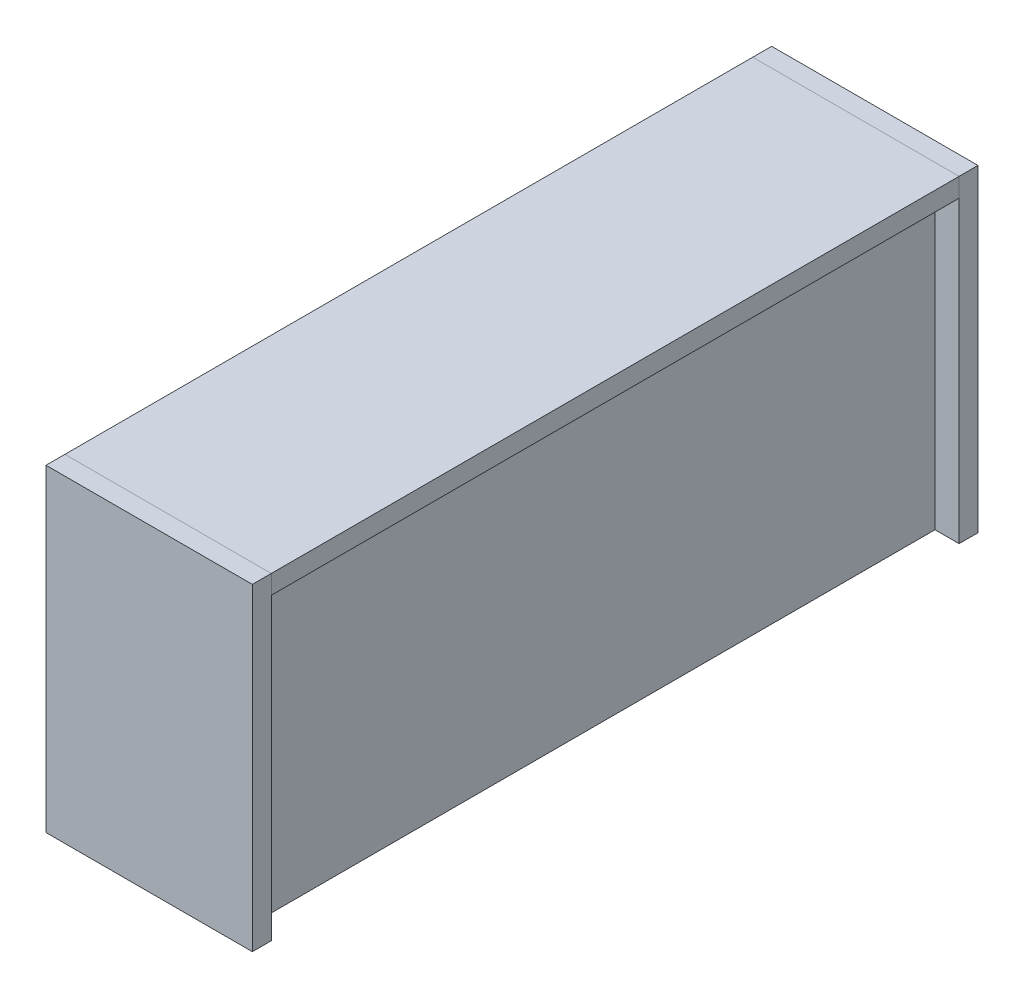
ISO-10303-21;
HEADER;
FILE_DESCRIPTION(('STEP AP214'),'2;1');
FILE_NAME('part.step','',(''),(''),'','','');
FILE_SCHEMA(('AUTOMOTIVE_DESIGN { 1 0 10303 214 1 1 1 1 }'));
ENDSEC;
DATA;
#1=APPLICATION_CONTEXT('core data for automotive mechanical design processes');
#2=APPLICATION_PROTOCOL_DEFINITION('international standard','automotive_design',2000,#1);
#3=PRODUCT_CONTEXT('',#1,'mechanical');
#4=PRODUCT('Part','Part','',(#3));
#5=PRODUCT_RELATED_PRODUCT_CATEGORY('part','',(#4));
#6=PRODUCT_DEFINITION_FORMATION('','',#4);
#7=PRODUCT_DEFINITION_CONTEXT('part definition',#1,'design');
#8=PRODUCT_DEFINITION('design','',#6,#7);
#9=PRODUCT_DEFINITION_SHAPE('','',#8);
#10=(LENGTH_UNIT() NAMED_UNIT(*) SI_UNIT(.MILLI.,.METRE.));
#11=(NAMED_UNIT(*) PLANE_ANGLE_UNIT() SI_UNIT($,.RADIAN.));
#12=(NAMED_UNIT(*) SI_UNIT($,.STERADIAN.) SOLID_ANGLE_UNIT());
#13=UNCERTAINTY_MEASURE_WITH_UNIT(LENGTH_MEASURE(1.E-05),#10,'distance_accuracy_value','');
#14=(GEOMETRIC_REPRESENTATION_CONTEXT(3) GLOBAL_UNCERTAINTY_ASSIGNED_CONTEXT((#13)) GLOBAL_UNIT_ASSIGNED_CONTEXT((#10,
#11,#12)) REPRESENTATION_CONTEXT('',''));
#15=CARTESIAN_POINT('',(0.,0.,0.));
#16=DIRECTION('',(0.,0.,1.));
#17=DIRECTION('',(1.,0.,0.));
#18=AXIS2_PLACEMENT_3D('',#15,#16,#17);
#19=CARTESIAN_POINT('',(-120.,0.,844.));
#20=DIRECTION('',(1.,0.,0.));
#21=DIRECTION('',(0.,1.,0.));
#22=AXIS2_PLACEMENT_3D('',#19,#20,#21);
#23=PLANE('',#22);
#24=DIRECTION('',(0.,-1.,0.));
#25=VECTOR('',#24,1.);
#26=CARTESIAN_POINT('',(-120.,0.,822.));
#27=LINE('',#26,#25);
#28=CARTESIAN_POINT('',(-120.,0.,822.));
#29=VERTEX_POINT('',#28);
#30=CARTESIAN_POINT('',(-120.,-370.,822.));
#31=VERTEX_POINT('',#30);
#32=EDGE_CURVE('E107',#29,#31,#27,.T.);
#33=ORIENTED_EDGE('',*,*,#32,.T.);
#34=DIRECTION('',(0.,0.,-1.));
#35=VECTOR('',#34,1.);
#36=CARTESIAN_POINT('',(-120.,-370.,844.));
#37=LINE('',#36,#35);
#38=CARTESIAN_POINT('',(-120.,-370.,844.));
#39=VERTEX_POINT('',#38);
#40=EDGE_CURVE('E12',#39,#31,#37,.T.);
#41=ORIENTED_EDGE('',*,*,#40,.F.);
#42=DIRECTION('',(0.,-1.,0.));
#43=VECTOR('',#42,1.);
#44=CARTESIAN_POINT('',(-120.,0.,844.));
#45=LINE('',#44,#43);
#46=CARTESIAN_POINT('',(-120.,0.,844.));
#47=VERTEX_POINT('',#46);
#48=EDGE_CURVE('E95',#47,#39,#45,.T.);
#49=ORIENTED_EDGE('',*,*,#48,.F.);
#50=DIRECTION('',(0.,0.,-1.));
#51=VECTOR('',#50,1.);
#52=CARTESIAN_POINT('',(-120.,0.,844.));
#53=LINE('',#52,#51);
#54=EDGE_CURVE('E103',#47,#29,#53,.T.);
#55=ORIENTED_EDGE('',*,*,#54,.T.);
#56=EDGE_LOOP('',(#33,#41,#49,#55));
#57=FACE_BOUND('',#56,.T.);
#58=ADVANCED_FACE('F44',(#57),#23,.F.);
#59=CARTESIAN_POINT('',(-120.,-370.,844.));
#60=DIRECTION('',(0.,1.,0.));
#61=DIRECTION('',(0.,0.,1.));
#62=AXIS2_PLACEMENT_3D('',#59,#60,#61);
#63=PLANE('',#62);
#64=DIRECTION('',(1.,0.,0.));
#65=VECTOR('',#64,1.);
#66=CARTESIAN_POINT('',(-120.,-370.,822.));
#67=LINE('',#66,#65);
#68=CARTESIAN_POINT('',(120.,-370.,822.));
#69=VERTEX_POINT('',#68);
#70=EDGE_CURVE('E99',#31,#69,#67,.T.);
#71=ORIENTED_EDGE('',*,*,#70,.T.);
#72=DIRECTION('',(0.,0.,-1.));
#73=VECTOR('',#72,1.);
#74=CARTESIAN_POINT('',(120.,-370.,844.));
#75=LINE('',#74,#73);
#76=CARTESIAN_POINT('',(120.,-370.,844.));
#77=VERTEX_POINT('',#76);
#78=EDGE_CURVE('E52',#77,#69,#75,.T.);
#79=ORIENTED_EDGE('',*,*,#78,.F.);
#80=DIRECTION('',(1.,0.,0.));
#81=VECTOR('',#80,1.);
#82=CARTESIAN_POINT('',(-120.,-370.,844.));
#83=LINE('',#82,#81);
#84=EDGE_CURVE('E90',#39,#77,#83,.T.);
#85=ORIENTED_EDGE('',*,*,#84,.F.);
#86=ORIENTED_EDGE('',*,*,#40,.T.);
#87=EDGE_LOOP('',(#71,#79,#85,#86));
#88=FACE_BOUND('',#87,.T.);
#89=ADVANCED_FACE('F98',(#88),#63,.F.);
#90=CARTESIAN_POINT('',(120.,0.,844.));
#91=DIRECTION('',(-1.,0.,0.));
#92=DIRECTION('',(0.,-1.,0.));
#93=AXIS2_PLACEMENT_3D('',#90,#91,#92);
#94=PLANE('',#93);
#95=DIRECTION('',(0.,1.,0.));
#96=VECTOR('',#95,1.);
#97=CARTESIAN_POINT('',(120.,0.,822.));
#98=LINE('',#97,#96);
#99=CARTESIAN_POINT('',(120.,0.,822.));
#100=VERTEX_POINT('',#99);
#101=EDGE_CURVE('E77',#69,#100,#98,.T.);
#102=ORIENTED_EDGE('',*,*,#101,.T.);
#103=DIRECTION('',(0.,0.,-1.));
#104=VECTOR('',#103,1.);
#105=CARTESIAN_POINT('',(120.,0.,844.));
#106=LINE('',#105,#104);
#107=CARTESIAN_POINT('',(120.,0.,844.));
#108=VERTEX_POINT('',#107);
#109=EDGE_CURVE('E100',#108,#100,#106,.T.);
#110=ORIENTED_EDGE('',*,*,#109,.F.);
#111=DIRECTION('',(0.,1.,0.));
#112=VECTOR('',#111,1.);
#113=CARTESIAN_POINT('',(120.,0.,844.));
#114=LINE('',#113,#112);
#115=EDGE_CURVE('E93',#77,#108,#114,.T.);
#116=ORIENTED_EDGE('',*,*,#115,.F.);
#117=ORIENTED_EDGE('',*,*,#78,.T.);
#118=EDGE_LOOP('',(#102,#110,#116,#117));
#119=FACE_BOUND('',#118,.T.);
#120=ADVANCED_FACE('F101',(#119),#94,.F.);
#121=CARTESIAN_POINT('',(-120.,0.,844.));
#122=DIRECTION('',(0.,-1.,0.));
#123=DIRECTION('',(1.,0.,0.));
#124=AXIS2_PLACEMENT_3D('',#121,#122,#123);
#125=PLANE('',#124);
#126=DIRECTION('',(-1.,0.,0.));
#127=VECTOR('',#126,1.);
#128=CARTESIAN_POINT('',(-120.,0.,822.));
#129=LINE('',#128,#127);
#130=EDGE_CURVE('E83',#100,#29,#129,.T.);
#131=ORIENTED_EDGE('',*,*,#130,.T.);
#132=ORIENTED_EDGE('',*,*,#54,.F.);
#133=DIRECTION('',(-1.,0.,0.));
#134=VECTOR('',#133,1.);
#135=CARTESIAN_POINT('',(-120.,0.,844.));
#136=LINE('',#135,#134);
#137=EDGE_CURVE('E60',#108,#47,#136,.T.);
#138=ORIENTED_EDGE('',*,*,#137,.F.);
#139=ORIENTED_EDGE('',*,*,#109,.T.);
#140=EDGE_LOOP('',(#131,#132,#138,#139));
#141=FACE_BOUND('',#140,.T.);
#142=ADVANCED_FACE('F114',(#141),#125,.F.);
#143=CARTESIAN_POINT('',(0.,0.,844.));
#144=DIRECTION('',(0.,0.,1.));
#145=DIRECTION('',(1.,0.,0.));
#146=AXIS2_PLACEMENT_3D('',#143,#144,#145);
#147=PLANE('',#146);
#148=ORIENTED_EDGE('',*,*,#48,.T.);
#149=ORIENTED_EDGE('',*,*,#84,.T.);
#150=ORIENTED_EDGE('',*,*,#115,.T.);
#151=ORIENTED_EDGE('',*,*,#137,.T.);
#152=EDGE_LOOP('',(#148,#149,#150,#151));
#153=FACE_BOUND('',#152,.T.);
#154=ADVANCED_FACE('F91',(#153),#147,.T.);
#155=CARTESIAN_POINT('',(0.,0.,822.));
#156=DIRECTION('',(0.,0.,1.));
#157=DIRECTION('',(1.,0.,0.));
#158=AXIS2_PLACEMENT_3D('',#155,#156,#157);
#159=PLANE('',#158);
#160=ORIENTED_EDGE('',*,*,#32,.F.);
#161=ORIENTED_EDGE('',*,*,#130,.F.);
#162=ORIENTED_EDGE('',*,*,#101,.F.);
#163=ORIENTED_EDGE('',*,*,#70,.F.);
#164=EDGE_LOOP('',(#160,#161,#162,#163));
#165=FACE_BOUND('',#164,.T.);
#166=ADVANCED_FACE('F117',(#165),#159,.F.);
#167=CLOSED_SHELL('',(#58,#89,#120,#142,#154,#166));
#168=MANIFOLD_SOLID_BREP('B2',#167);
#169=CARTESIAN_POINT('',(-120.,0.,1063.00622398602));
#170=DIRECTION('',(1.,0.,0.));
#171=DIRECTION('',(0.,0.,-1.));
#172=AXIS2_PLACEMENT_3D('',#169,#170,#171);
#173=PLANE('',#172);
#174=DIRECTION('',(0.,-1.,0.));
#175=VECTOR('',#174,1.);
#176=CARTESIAN_POINT('',(-120.,0.,822.));
#177=LINE('',#176,#175);
#178=CARTESIAN_POINT('',(-120.,0.,822.));
#179=VERTEX_POINT('',#178);
#180=CARTESIAN_POINT('',(-120.,-22.,822.));
#181=VERTEX_POINT('',#180);
#182=EDGE_CURVE('E228',#179,#181,#177,.T.);
#183=ORIENTED_EDGE('',*,*,#182,.F.);
#184=DIRECTION('',(0.,0.,-1.));
#185=VECTOR('',#184,1.);
#186=CARTESIAN_POINT('',(-120.,0.,1063.00622398602));
#187=LINE('',#186,#185);
#188=CARTESIAN_POINT('',(-120.,0.,22.));
#189=VERTEX_POINT('',#188);
#190=EDGE_CURVE('E182',#179,#189,#187,.T.);
#191=ORIENTED_EDGE('',*,*,#190,.T.);
#192=DIRECTION('',(0.,-1.,0.));
#193=VECTOR('',#192,1.);
#194=CARTESIAN_POINT('',(-120.,0.,22.));
#195=LINE('',#194,#193);
#196=CARTESIAN_POINT('',(-120.,-22.,22.));
#197=VERTEX_POINT('',#196);
#198=EDGE_CURVE('E226',#189,#197,#195,.T.);
#199=ORIENTED_EDGE('',*,*,#198,.T.);
#200=DIRECTION('',(0.,0.,-1.));
#201=VECTOR('',#200,1.);
#202=CARTESIAN_POINT('',(-120.,-22.,1063.00622398602));
#203=LINE('',#202,#201);
#204=EDGE_CURVE('E217',#181,#197,#203,.T.);
#205=ORIENTED_EDGE('',*,*,#204,.F.);
#206=EDGE_LOOP('',(#183,#191,#199,#205));
#207=FACE_BOUND('',#206,.T.);
#208=ADVANCED_FACE('F178',(#207),#173,.F.);
#209=CARTESIAN_POINT('',(-120.,-22.,1063.00622398602));
#210=DIRECTION('',(0.,1.,0.));
#211=DIRECTION('',(-1.,0.,0.));
#212=AXIS2_PLACEMENT_3D('',#209,#210,#211);
#213=PLANE('',#212);
#214=DIRECTION('',(1.,0.,0.));
#215=VECTOR('',#214,1.);
#216=CARTESIAN_POINT('',(-120.,-22.,822.));
#217=LINE('',#216,#215);
#218=CARTESIAN_POINT('',(120.,-22.,822.));
#219=VERTEX_POINT('',#218);
#220=EDGE_CURVE('E187',#181,#219,#217,.T.);
#221=ORIENTED_EDGE('',*,*,#220,.F.);
#222=ORIENTED_EDGE('',*,*,#204,.T.);
#223=DIRECTION('',(1.,0.,0.));
#224=VECTOR('',#223,1.);
#225=CARTESIAN_POINT('',(-120.,-22.,22.));
#226=LINE('',#225,#224);
#227=CARTESIAN_POINT('',(120.,-22.,22.));
#228=VERTEX_POINT('',#227);
#229=EDGE_CURVE('E238',#197,#228,#226,.T.);
#230=ORIENTED_EDGE('',*,*,#229,.T.);
#231=DIRECTION('',(0.,0.,-1.));
#232=VECTOR('',#231,1.);
#233=CARTESIAN_POINT('',(120.,-22.,1063.00622398602));
#234=LINE('',#233,#232);
#235=EDGE_CURVE('E247',#219,#228,#234,.T.);
#236=ORIENTED_EDGE('',*,*,#235,.F.);
#237=EDGE_LOOP('',(#221,#222,#230,#236));
#238=FACE_BOUND('',#237,.T.);
#239=ADVANCED_FACE('F251',(#238),#213,.F.);
#240=CARTESIAN_POINT('',(120.,0.,1063.00622398602));
#241=DIRECTION('',(-1.,0.,0.));
#242=DIRECTION('',(0.,0.,1.));
#243=AXIS2_PLACEMENT_3D('',#240,#241,#242);
#244=PLANE('',#243);
#245=DIRECTION('',(0.,1.,0.));
#246=VECTOR('',#245,1.);
#247=CARTESIAN_POINT('',(120.,0.,822.));
#248=LINE('',#247,#246);
#249=CARTESIAN_POINT('',(120.,0.,822.));
#250=VERTEX_POINT('',#249);
#251=EDGE_CURVE('E42',#219,#250,#248,.T.);
#252=ORIENTED_EDGE('',*,*,#251,.F.);
#253=ORIENTED_EDGE('',*,*,#235,.T.);
#254=DIRECTION('',(0.,1.,0.));
#255=VECTOR('',#254,1.);
#256=CARTESIAN_POINT('',(120.,0.,22.));
#257=LINE('',#256,#255);
#258=CARTESIAN_POINT('',(120.,0.,22.));
#259=VERTEX_POINT('',#258);
#260=EDGE_CURVE('E248',#228,#259,#257,.T.);
#261=ORIENTED_EDGE('',*,*,#260,.T.);
#262=DIRECTION('',(0.,0.,-1.));
#263=VECTOR('',#262,1.);
#264=CARTESIAN_POINT('',(120.,0.,1063.00622398602));
#265=LINE('',#264,#263);
#266=EDGE_CURVE('E200',#250,#259,#265,.T.);
#267=ORIENTED_EDGE('',*,*,#266,.F.);
#268=EDGE_LOOP('',(#252,#253,#261,#267));
#269=FACE_BOUND('',#268,.T.);
#270=ADVANCED_FACE('F250',(#269),#244,.F.);
#271=CARTESIAN_POINT('',(-120.,0.,1063.00622398602));
#272=DIRECTION('',(0.,-1.,0.));
#273=DIRECTION('',(1.,0.,0.));
#274=AXIS2_PLACEMENT_3D('',#271,#272,#273);
#275=PLANE('',#274);
#276=DIRECTION('',(-1.,0.,0.));
#277=VECTOR('',#276,1.);
#278=CARTESIAN_POINT('',(-120.,0.,822.));
#279=LINE('',#278,#277);
#280=EDGE_CURVE('E235',#250,#179,#279,.T.);
#281=ORIENTED_EDGE('',*,*,#280,.F.);
#282=ORIENTED_EDGE('',*,*,#266,.T.);
#283=DIRECTION('',(-1.,0.,0.));
#284=VECTOR('',#283,1.);
#285=CARTESIAN_POINT('',(-120.,0.,22.));
#286=LINE('',#285,#284);
#287=EDGE_CURVE('E231',#259,#189,#286,.T.);
#288=ORIENTED_EDGE('',*,*,#287,.T.);
#289=ORIENTED_EDGE('',*,*,#190,.F.);
#290=EDGE_LOOP('',(#281,#282,#288,#289));
#291=FACE_BOUND('',#290,.T.);
#292=ADVANCED_FACE('F232',(#291),#275,.F.);
#293=CARTESIAN_POINT('',(0.,0.,22.));
#294=DIRECTION('',(0.,0.,1.));
#295=DIRECTION('',(1.,0.,0.));
#296=AXIS2_PLACEMENT_3D('',#293,#294,#295);
#297=PLANE('',#296);
#298=ORIENTED_EDGE('',*,*,#198,.F.);
#299=ORIENTED_EDGE('',*,*,#287,.F.);
#300=ORIENTED_EDGE('',*,*,#260,.F.);
#301=ORIENTED_EDGE('',*,*,#229,.F.);
#302=EDGE_LOOP('',(#298,#299,#300,#301));
#303=FACE_BOUND('',#302,.T.);
#304=ADVANCED_FACE('F237',(#303),#297,.F.);
#305=CARTESIAN_POINT('',(0.,0.,822.));
#306=DIRECTION('',(0.,0.,1.));
#307=DIRECTION('',(1.,0.,0.));
#308=AXIS2_PLACEMENT_3D('',#305,#306,#307);
#309=PLANE('',#308);
#310=ORIENTED_EDGE('',*,*,#280,.T.);
#311=ORIENTED_EDGE('',*,*,#182,.T.);
#312=ORIENTED_EDGE('',*,*,#220,.T.);
#313=ORIENTED_EDGE('',*,*,#251,.T.);
#314=EDGE_LOOP('',(#310,#311,#312,#313));
#315=FACE_BOUND('',#314,.T.);
#316=ADVANCED_FACE('F180',(#315),#309,.T.);
#317=CLOSED_SHELL('',(#208,#239,#270,#292,#304,#316));
#318=MANIFOLD_SOLID_BREP('B6',#317);
#319=CARTESIAN_POINT('',(-70.,-22.,822.));
#320=DIRECTION('',(-1.,0.,0.));
#321=DIRECTION('',(0.,-1.,0.));
#322=AXIS2_PLACEMENT_3D('',#319,#320,#321);
#323=PLANE('',#322);
#324=DIRECTION('',(0.,1.,0.));
#325=VECTOR('',#324,1.);
#326=CARTESIAN_POINT('',(-70.,-22.,22.));
#327=LINE('',#326,#325);
#328=CARTESIAN_POINT('',(-70.,-370.,22.));
#329=VERTEX_POINT('',#328);
#330=CARTESIAN_POINT('',(-70.,-22.,22.));
#331=VERTEX_POINT('',#330);
#332=EDGE_CURVE('E375',#329,#331,#327,.T.);
#333=ORIENTED_EDGE('',*,*,#332,.T.);
#334=DIRECTION('',(0.,0.,-1.));
#335=VECTOR('',#334,1.);
#336=CARTESIAN_POINT('',(-70.,-22.,822.));
#337=LINE('',#336,#335);
#338=CARTESIAN_POINT('',(-70.,-22.,822.));
#339=VERTEX_POINT('',#338);
#340=EDGE_CURVE('E176',#339,#331,#337,.T.);
#341=ORIENTED_EDGE('',*,*,#340,.F.);
#342=DIRECTION('',(0.,1.,0.));
#343=VECTOR('',#342,1.);
#344=CARTESIAN_POINT('',(-70.,-22.,822.));
#345=LINE('',#344,#343);
#346=CARTESIAN_POINT('',(-70.,-370.,822.));
#347=VERTEX_POINT('',#346);
#348=EDGE_CURVE('E363',#347,#339,#345,.T.);
#349=ORIENTED_EDGE('',*,*,#348,.F.);
#350=DIRECTION('',(0.,0.,-1.));
#351=VECTOR('',#350,1.);
#352=CARTESIAN_POINT('',(-70.,-370.,822.));
#353=LINE('',#352,#351);
#354=EDGE_CURVE('E371',#347,#329,#353,.T.);
#355=ORIENTED_EDGE('',*,*,#354,.T.);
#356=EDGE_LOOP('',(#333,#341,#349,#355));
#357=FACE_BOUND('',#356,.T.);
#358=ADVANCED_FACE('F312',(#357),#323,.F.);
#359=CARTESIAN_POINT('',(-70.,-22.,822.));
#360=DIRECTION('',(0.,-1.,0.));
#361=DIRECTION('',(1.,0.,0.));
#362=AXIS2_PLACEMENT_3D('',#359,#360,#361);
#363=PLANE('',#362);
#364=DIRECTION('',(-1.,0.,0.));
#365=VECTOR('',#364,1.);
#366=CARTESIAN_POINT('',(-70.,-22.,22.));
#367=LINE('',#366,#365);
#368=CARTESIAN_POINT('',(-92.,-22.,22.));
#369=VERTEX_POINT('',#368);
#370=EDGE_CURVE('E367',#331,#369,#367,.T.);
#371=ORIENTED_EDGE('',*,*,#370,.T.);
#372=DIRECTION('',(0.,0.,-1.));
#373=VECTOR('',#372,1.);
#374=CARTESIAN_POINT('',(-92.,-22.,822.));
#375=LINE('',#374,#373);
#376=CARTESIAN_POINT('',(-92.,-22.,822.));
#377=VERTEX_POINT('',#376);
#378=EDGE_CURVE('E320',#377,#369,#375,.T.);
#379=ORIENTED_EDGE('',*,*,#378,.F.);
#380=DIRECTION('',(-1.,0.,0.));
#381=VECTOR('',#380,1.);
#382=CARTESIAN_POINT('',(-70.,-22.,822.));
#383=LINE('',#382,#381);
#384=EDGE_CURVE('E358',#339,#377,#383,.T.);
#385=ORIENTED_EDGE('',*,*,#384,.F.);
#386=ORIENTED_EDGE('',*,*,#340,.T.);
#387=EDGE_LOOP('',(#371,#379,#385,#386));
#388=FACE_BOUND('',#387,.T.);
#389=ADVANCED_FACE('F366',(#388),#363,.F.);
#390=CARTESIAN_POINT('',(-92.,-22.,822.));
#391=DIRECTION('',(1.,0.,0.));
#392=DIRECTION('',(0.,1.,0.));
#393=AXIS2_PLACEMENT_3D('',#390,#391,#392);
#394=PLANE('',#393);
#395=DIRECTION('',(0.,-1.,0.));
#396=VECTOR('',#395,1.);
#397=CARTESIAN_POINT('',(-92.,-22.,22.));
#398=LINE('',#397,#396);
#399=CARTESIAN_POINT('',(-92.,-370.,22.));
#400=VERTEX_POINT('',#399);
#401=EDGE_CURVE('E345',#369,#400,#398,.T.);
#402=ORIENTED_EDGE('',*,*,#401,.T.);
#403=DIRECTION('',(0.,0.,-1.));
#404=VECTOR('',#403,1.);
#405=CARTESIAN_POINT('',(-92.,-370.,822.));
#406=LINE('',#405,#404);
#407=CARTESIAN_POINT('',(-92.,-370.,822.));
#408=VERTEX_POINT('',#407);
#409=EDGE_CURVE('E368',#408,#400,#406,.T.);
#410=ORIENTED_EDGE('',*,*,#409,.F.);
#411=DIRECTION('',(0.,-1.,0.));
#412=VECTOR('',#411,1.);
#413=CARTESIAN_POINT('',(-92.,-22.,822.));
#414=LINE('',#413,#412);
#415=EDGE_CURVE('E361',#377,#408,#414,.T.);
#416=ORIENTED_EDGE('',*,*,#415,.F.);
#417=ORIENTED_EDGE('',*,*,#378,.T.);
#418=EDGE_LOOP('',(#402,#410,#416,#417));
#419=FACE_BOUND('',#418,.T.);
#420=ADVANCED_FACE('F369',(#419),#394,.F.);
#421=CARTESIAN_POINT('',(-70.,-370.,822.));
#422=DIRECTION('',(0.,1.,0.));
#423=DIRECTION('',(0.,0.,1.));
#424=AXIS2_PLACEMENT_3D('',#421,#422,#423);
#425=PLANE('',#424);
#426=DIRECTION('',(1.,0.,0.));
#427=VECTOR('',#426,1.);
#428=CARTESIAN_POINT('',(-70.,-370.,22.));
#429=LINE('',#428,#427);
#430=EDGE_CURVE('E351',#400,#329,#429,.T.);
#431=ORIENTED_EDGE('',*,*,#430,.T.);
#432=ORIENTED_EDGE('',*,*,#354,.F.);
#433=DIRECTION('',(1.,0.,0.));
#434=VECTOR('',#433,1.);
#435=CARTESIAN_POINT('',(-70.,-370.,822.));
#436=LINE('',#435,#434);
#437=EDGE_CURVE('E328',#408,#347,#436,.T.);
#438=ORIENTED_EDGE('',*,*,#437,.F.);
#439=ORIENTED_EDGE('',*,*,#409,.T.);
#440=EDGE_LOOP('',(#431,#432,#438,#439));
#441=FACE_BOUND('',#440,.T.);
#442=ADVANCED_FACE('F382',(#441),#425,.F.);
#443=CARTESIAN_POINT('',(0.,0.,822.));
#444=DIRECTION('',(0.,0.,-1.));
#445=DIRECTION('',(-1.,0.,0.));
#446=AXIS2_PLACEMENT_3D('',#443,#444,#445);
#447=PLANE('',#446);
#448=ORIENTED_EDGE('',*,*,#348,.T.);
#449=ORIENTED_EDGE('',*,*,#384,.T.);
#450=ORIENTED_EDGE('',*,*,#415,.T.);
#451=ORIENTED_EDGE('',*,*,#437,.T.);
#452=EDGE_LOOP('',(#448,#449,#450,#451));
#453=FACE_BOUND('',#452,.T.);
#454=ADVANCED_FACE('F359',(#453),#447,.F.);
#455=CARTESIAN_POINT('',(0.,0.,22.));
#456=DIRECTION('',(0.,0.,-1.));
#457=DIRECTION('',(-1.,0.,0.));
#458=AXIS2_PLACEMENT_3D('',#455,#456,#457);
#459=PLANE('',#458);
#460=ORIENTED_EDGE('',*,*,#332,.F.);
#461=ORIENTED_EDGE('',*,*,#430,.F.);
#462=ORIENTED_EDGE('',*,*,#401,.F.);
#463=ORIENTED_EDGE('',*,*,#370,.F.);
#464=EDGE_LOOP('',(#460,#461,#462,#463));
#465=FACE_BOUND('',#464,.T.);
#466=ADVANCED_FACE('F385',(#465),#459,.T.);
#467=CLOSED_SHELL('',(#358,#389,#420,#442,#454,#466));
#468=MANIFOLD_SOLID_BREP('B36',#467);
#469=CARTESIAN_POINT('',(70.,-22.,822.));
#470=DIRECTION('',(1.,0.,0.));
#471=DIRECTION('',(0.,1.,0.));
#472=AXIS2_PLACEMENT_3D('',#469,#470,#471);
#473=PLANE('',#472);
#474=DIRECTION('',(0.,-1.,0.));
#475=VECTOR('',#474,1.);
#476=CARTESIAN_POINT('',(70.,-22.,22.));
#477=LINE('',#476,#475);
#478=CARTESIAN_POINT('',(70.,-22.,22.));
#479=VERTEX_POINT('',#478);
#480=CARTESIAN_POINT('',(70.,-370.,22.));
#481=VERTEX_POINT('',#480);
#482=EDGE_CURVE('E508',#479,#481,#477,.T.);
#483=ORIENTED_EDGE('',*,*,#482,.T.);
#484=DIRECTION('',(0.,0.,-1.));
#485=VECTOR('',#484,1.);
#486=CARTESIAN_POINT('',(70.,-370.,822.));
#487=LINE('',#486,#485);
#488=CARTESIAN_POINT('',(70.,-370.,822.));
#489=VERTEX_POINT('',#488);
#490=EDGE_CURVE('E310',#489,#481,#487,.T.);
#491=ORIENTED_EDGE('',*,*,#490,.F.);
#492=DIRECTION('',(0.,-1.,0.));
#493=VECTOR('',#492,1.);
#494=CARTESIAN_POINT('',(70.,-22.,822.));
#495=LINE('',#494,#493);
#496=CARTESIAN_POINT('',(70.,-22.,822.));
#497=VERTEX_POINT('',#496);
#498=EDGE_CURVE('E496',#497,#489,#495,.T.);
#499=ORIENTED_EDGE('',*,*,#498,.F.);
#500=DIRECTION('',(0.,0.,-1.));
#501=VECTOR('',#500,1.);
#502=CARTESIAN_POINT('',(70.,-22.,822.));
#503=LINE('',#502,#501);
#504=EDGE_CURVE('E504',#497,#479,#503,.T.);
#505=ORIENTED_EDGE('',*,*,#504,.T.);
#506=EDGE_LOOP('',(#483,#491,#499,#505));
#507=FACE_BOUND('',#506,.T.);
#508=ADVANCED_FACE('F445',(#507),#473,.F.);
#509=CARTESIAN_POINT('',(70.,-370.,822.));
#510=DIRECTION('',(0.,1.,0.));
#511=DIRECTION('',(0.,0.,1.));
#512=AXIS2_PLACEMENT_3D('',#509,#510,#511);
#513=PLANE('',#512);
#514=DIRECTION('',(1.,0.,0.));
#515=VECTOR('',#514,1.);
#516=CARTESIAN_POINT('',(70.,-370.,22.));
#517=LINE('',#516,#515);
#518=CARTESIAN_POINT('',(92.0000000000001,-370.,22.));
#519=VERTEX_POINT('',#518);
#520=EDGE_CURVE('E500',#481,#519,#517,.T.);
#521=ORIENTED_EDGE('',*,*,#520,.T.);
#522=DIRECTION('',(0.,0.,-1.));
#523=VECTOR('',#522,1.);
#524=CARTESIAN_POINT('',(92.0000000000001,-370.,822.));
#525=LINE('',#524,#523);
#526=CARTESIAN_POINT('',(92.0000000000001,-370.,822.));
#527=VERTEX_POINT('',#526);
#528=EDGE_CURVE('E453',#527,#519,#525,.T.);
#529=ORIENTED_EDGE('',*,*,#528,.F.);
#530=DIRECTION('',(1.,0.,0.));
#531=VECTOR('',#530,1.);
#532=CARTESIAN_POINT('',(70.,-370.,822.));
#533=LINE('',#532,#531);
#534=EDGE_CURVE('E491',#489,#527,#533,.T.);
#535=ORIENTED_EDGE('',*,*,#534,.F.);
#536=ORIENTED_EDGE('',*,*,#490,.T.);
#537=EDGE_LOOP('',(#521,#529,#535,#536));
#538=FACE_BOUND('',#537,.T.);
#539=ADVANCED_FACE('F499',(#538),#513,.F.);
#540=CARTESIAN_POINT('',(92.,-22.,822.));
#541=DIRECTION('',(-1.,0.,0.));
#542=DIRECTION('',(0.,-1.,0.));
#543=AXIS2_PLACEMENT_3D('',#540,#541,#542);
#544=PLANE('',#543);
#545=DIRECTION('',(0.,1.,0.));
#546=VECTOR('',#545,1.);
#547=CARTESIAN_POINT('',(92.,-22.,22.));
#548=LINE('',#547,#546);
#549=CARTESIAN_POINT('',(92.,-22.,22.));
#550=VERTEX_POINT('',#549);
#551=EDGE_CURVE('E478',#519,#550,#548,.T.);
#552=ORIENTED_EDGE('',*,*,#551,.T.);
#553=DIRECTION('',(0.,0.,-1.));
#554=VECTOR('',#553,1.);
#555=CARTESIAN_POINT('',(92.,-22.,822.));
#556=LINE('',#555,#554);
#557=CARTESIAN_POINT('',(92.,-22.,822.));
#558=VERTEX_POINT('',#557);
#559=EDGE_CURVE('E501',#558,#550,#556,.T.);
#560=ORIENTED_EDGE('',*,*,#559,.F.);
#561=DIRECTION('',(0.,1.,0.));
#562=VECTOR('',#561,1.);
#563=CARTESIAN_POINT('',(92.,-22.,822.));
#564=LINE('',#563,#562);
#565=EDGE_CURVE('E494',#527,#558,#564,.T.);
#566=ORIENTED_EDGE('',*,*,#565,.F.);
#567=ORIENTED_EDGE('',*,*,#528,.T.);
#568=EDGE_LOOP('',(#552,#560,#566,#567));
#569=FACE_BOUND('',#568,.T.);
#570=ADVANCED_FACE('F502',(#569),#544,.F.);
#571=CARTESIAN_POINT('',(70.,-22.,822.));
#572=DIRECTION('',(0.,-1.,0.));
#573=DIRECTION('',(0.,0.,-1.));
#574=AXIS2_PLACEMENT_3D('',#571,#572,#573);
#575=PLANE('',#574);
#576=DIRECTION('',(-1.,0.,0.));
#577=VECTOR('',#576,1.);
#578=CARTESIAN_POINT('',(70.,-22.,22.));
#579=LINE('',#578,#577);
#580=EDGE_CURVE('E484',#550,#479,#579,.T.);
#581=ORIENTED_EDGE('',*,*,#580,.T.);
#582=ORIENTED_EDGE('',*,*,#504,.F.);
#583=DIRECTION('',(-1.,0.,0.));
#584=VECTOR('',#583,1.);
#585=CARTESIAN_POINT('',(70.,-22.,822.));
#586=LINE('',#585,#584);
#587=EDGE_CURVE('E461',#558,#497,#586,.T.);
#588=ORIENTED_EDGE('',*,*,#587,.F.);
#589=ORIENTED_EDGE('',*,*,#559,.T.);
#590=EDGE_LOOP('',(#581,#582,#588,#589));
#591=FACE_BOUND('',#590,.T.);
#592=ADVANCED_FACE('F515',(#591),#575,.F.);
#593=CARTESIAN_POINT('',(0.,0.,822.));
#594=DIRECTION('',(0.,0.,1.));
#595=DIRECTION('',(1.,0.,0.));
#596=AXIS2_PLACEMENT_3D('',#593,#594,#595);
#597=PLANE('',#596);
#598=ORIENTED_EDGE('',*,*,#498,.T.);
#599=ORIENTED_EDGE('',*,*,#534,.T.);
#600=ORIENTED_EDGE('',*,*,#565,.T.);
#601=ORIENTED_EDGE('',*,*,#587,.T.);
#602=EDGE_LOOP('',(#598,#599,#600,#601));
#603=FACE_BOUND('',#602,.T.);
#604=ADVANCED_FACE('F492',(#603),#597,.T.);
#605=CARTESIAN_POINT('',(0.,0.,22.));
#606=DIRECTION('',(0.,0.,1.));
#607=DIRECTION('',(1.,0.,0.));
#608=AXIS2_PLACEMENT_3D('',#605,#606,#607);
#609=PLANE('',#608);
#610=ORIENTED_EDGE('',*,*,#482,.F.);
#611=ORIENTED_EDGE('',*,*,#580,.F.);
#612=ORIENTED_EDGE('',*,*,#551,.F.);
#613=ORIENTED_EDGE('',*,*,#520,.F.);
#614=EDGE_LOOP('',(#610,#611,#612,#613));
#615=FACE_BOUND('',#614,.T.);
#616=ADVANCED_FACE('F518',(#615),#609,.F.);
#617=CLOSED_SHELL('',(#508,#539,#570,#592,#604,#616));
#618=MANIFOLD_SOLID_BREP('B170',#617);
#619=CARTESIAN_POINT('',(-120.,0.,22.));
#620=DIRECTION('',(1.,0.,0.));
#621=DIRECTION('',(0.,1.,0.));
#622=AXIS2_PLACEMENT_3D('',#619,#620,#621);
#623=PLANE('',#622);
#624=DIRECTION('',(0.,-1.,0.));
#625=VECTOR('',#624,1.);
#626=CARTESIAN_POINT('',(-120.,0.,0.));
#627=LINE('',#626,#625);
#628=CARTESIAN_POINT('',(-120.,0.,0.));
#629=VERTEX_POINT('',#628);
#630=CARTESIAN_POINT('',(-120.,-370.,0.));
#631=VERTEX_POINT('',#630);
#632=EDGE_CURVE('E632',#629,#631,#627,.T.);
#633=ORIENTED_EDGE('',*,*,#632,.T.);
#634=DIRECTION('',(0.,0.,-1.));
#635=VECTOR('',#634,1.);
#636=CARTESIAN_POINT('',(-120.,-370.,22.));
#637=LINE('',#636,#635);
#638=CARTESIAN_POINT('',(-120.,-370.,22.));
#639=VERTEX_POINT('',#638);
#640=EDGE_CURVE('E443',#639,#631,#637,.T.);
#641=ORIENTED_EDGE('',*,*,#640,.F.);
#642=DIRECTION('',(0.,-1.,0.));
#643=VECTOR('',#642,1.);
#644=CARTESIAN_POINT('',(-120.,0.,22.));
#645=LINE('',#644,#643);
#646=CARTESIAN_POINT('',(-120.,0.,22.));
#647=VERTEX_POINT('',#646);
#648=EDGE_CURVE('E620',#647,#639,#645,.T.);
#649=ORIENTED_EDGE('',*,*,#648,.F.);
#650=DIRECTION('',(0.,0.,-1.));
#651=VECTOR('',#650,1.);
#652=CARTESIAN_POINT('',(-120.,0.,22.));
#653=LINE('',#652,#651);
#654=EDGE_CURVE('E628',#647,#629,#653,.T.);
#655=ORIENTED_EDGE('',*,*,#654,.T.);
#656=EDGE_LOOP('',(#633,#641,#649,#655));
#657=FACE_BOUND('',#656,.T.);
#658=ADVANCED_FACE('F569',(#657),#623,.F.);
#659=CARTESIAN_POINT('',(-120.,-370.,22.));
#660=DIRECTION('',(0.,1.,0.));
#661=DIRECTION('',(-1.,0.,0.));
#662=AXIS2_PLACEMENT_3D('',#659,#660,#661);
#663=PLANE('',#662);
#664=DIRECTION('',(1.,0.,0.));
#665=VECTOR('',#664,1.);
#666=CARTESIAN_POINT('',(-120.,-370.,0.));
#667=LINE('',#666,#665);
#668=CARTESIAN_POINT('',(120.,-370.,0.));
#669=VERTEX_POINT('',#668);
#670=EDGE_CURVE('E624',#631,#669,#667,.T.);
#671=ORIENTED_EDGE('',*,*,#670,.T.);
#672=DIRECTION('',(0.,0.,-1.));
#673=VECTOR('',#672,1.);
#674=CARTESIAN_POINT('',(120.,-370.,22.));
#675=LINE('',#674,#673);
#676=CARTESIAN_POINT('',(120.,-370.,22.));
#677=VERTEX_POINT('',#676);
#678=EDGE_CURVE('E577',#677,#669,#675,.T.);
#679=ORIENTED_EDGE('',*,*,#678,.F.);
#680=DIRECTION('',(1.,0.,0.));
#681=VECTOR('',#680,1.);
#682=CARTESIAN_POINT('',(-120.,-370.,22.));
#683=LINE('',#682,#681);
#684=EDGE_CURVE('E615',#639,#677,#683,.T.);
#685=ORIENTED_EDGE('',*,*,#684,.F.);
#686=ORIENTED_EDGE('',*,*,#640,.T.);
#687=EDGE_LOOP('',(#671,#679,#685,#686));
#688=FACE_BOUND('',#687,.T.);
#689=ADVANCED_FACE('F623',(#688),#663,.F.);
#690=CARTESIAN_POINT('',(120.,0.,22.));
#691=DIRECTION('',(-1.,0.,0.));
#692=DIRECTION('',(0.,-1.,0.));
#693=AXIS2_PLACEMENT_3D('',#690,#691,#692);
#694=PLANE('',#693);
#695=DIRECTION('',(0.,1.,0.));
#696=VECTOR('',#695,1.);
#697=CARTESIAN_POINT('',(120.,0.,0.));
#698=LINE('',#697,#696);
#699=CARTESIAN_POINT('',(120.,0.,0.));
#700=VERTEX_POINT('',#699);
#701=EDGE_CURVE('E602',#669,#700,#698,.T.);
#702=ORIENTED_EDGE('',*,*,#701,.T.);
#703=DIRECTION('',(0.,0.,-1.));
#704=VECTOR('',#703,1.);
#705=CARTESIAN_POINT('',(120.,0.,22.));
#706=LINE('',#705,#704);
#707=CARTESIAN_POINT('',(120.,0.,22.));
#708=VERTEX_POINT('',#707);
#709=EDGE_CURVE('E625',#708,#700,#706,.T.);
#710=ORIENTED_EDGE('',*,*,#709,.F.);
#711=DIRECTION('',(0.,1.,0.));
#712=VECTOR('',#711,1.);
#713=CARTESIAN_POINT('',(120.,0.,22.));
#714=LINE('',#713,#712);
#715=EDGE_CURVE('E618',#677,#708,#714,.T.);
#716=ORIENTED_EDGE('',*,*,#715,.F.);
#717=ORIENTED_EDGE('',*,*,#678,.T.);
#718=EDGE_LOOP('',(#702,#710,#716,#717));
#719=FACE_BOUND('',#718,.T.);
#720=ADVANCED_FACE('F626',(#719),#694,.F.);
#721=CARTESIAN_POINT('',(-120.,0.,22.));
#722=DIRECTION('',(0.,-1.,0.));
#723=DIRECTION('',(1.,0.,0.));
#724=AXIS2_PLACEMENT_3D('',#721,#722,#723);
#725=PLANE('',#724);
#726=DIRECTION('',(-1.,0.,0.));
#727=VECTOR('',#726,1.);
#728=CARTESIAN_POINT('',(-120.,0.,0.));
#729=LINE('',#728,#727);
#730=EDGE_CURVE('E608',#700,#629,#729,.T.);
#731=ORIENTED_EDGE('',*,*,#730,.T.);
#732=ORIENTED_EDGE('',*,*,#654,.F.);
#733=DIRECTION('',(-1.,0.,0.));
#734=VECTOR('',#733,1.);
#735=CARTESIAN_POINT('',(-120.,0.,22.));
#736=LINE('',#735,#734);
#737=EDGE_CURVE('E585',#708,#647,#736,.T.);
#738=ORIENTED_EDGE('',*,*,#737,.F.);
#739=ORIENTED_EDGE('',*,*,#709,.T.);
#740=EDGE_LOOP('',(#731,#732,#738,#739));
#741=FACE_BOUND('',#740,.T.);
#742=ADVANCED_FACE('F639',(#741),#725,.F.);
#743=CARTESIAN_POINT('',(0.,0.,22.));
#744=DIRECTION('',(0.,0.,1.));
#745=DIRECTION('',(1.,0.,0.));
#746=AXIS2_PLACEMENT_3D('',#743,#744,#745);
#747=PLANE('',#746);
#748=ORIENTED_EDGE('',*,*,#648,.T.);
#749=ORIENTED_EDGE('',*,*,#684,.T.);
#750=ORIENTED_EDGE('',*,*,#715,.T.);
#751=ORIENTED_EDGE('',*,*,#737,.T.);
#752=EDGE_LOOP('',(#748,#749,#750,#751));
#753=FACE_BOUND('',#752,.T.);
#754=ADVANCED_FACE('F616',(#753),#747,.T.);
#755=CARTESIAN_POINT('',(0.,0.,0.));
#756=DIRECTION('',(0.,0.,1.));
#757=DIRECTION('',(1.,0.,0.));
#758=AXIS2_PLACEMENT_3D('',#755,#756,#757);
#759=PLANE('',#758);
#760=ORIENTED_EDGE('',*,*,#632,.F.);
#761=ORIENTED_EDGE('',*,*,#730,.F.);
#762=ORIENTED_EDGE('',*,*,#701,.F.);
#763=ORIENTED_EDGE('',*,*,#670,.F.);
#764=EDGE_LOOP('',(#760,#761,#762,#763));
#765=FACE_BOUND('',#764,.T.);
#766=ADVANCED_FACE('F642',(#765),#759,.F.);
#767=CLOSED_SHELL('',(#658,#689,#720,#742,#754,#766));
#768=MANIFOLD_SOLID_BREP('B304',#767);
#769=ADVANCED_BREP_SHAPE_REPRESENTATION('',(#18,#168,#318,#468,#618,#768),#14);
#770=SHAPE_DEFINITION_REPRESENTATION(#9,#769);
ENDSEC;
END-ISO-10303-21;
